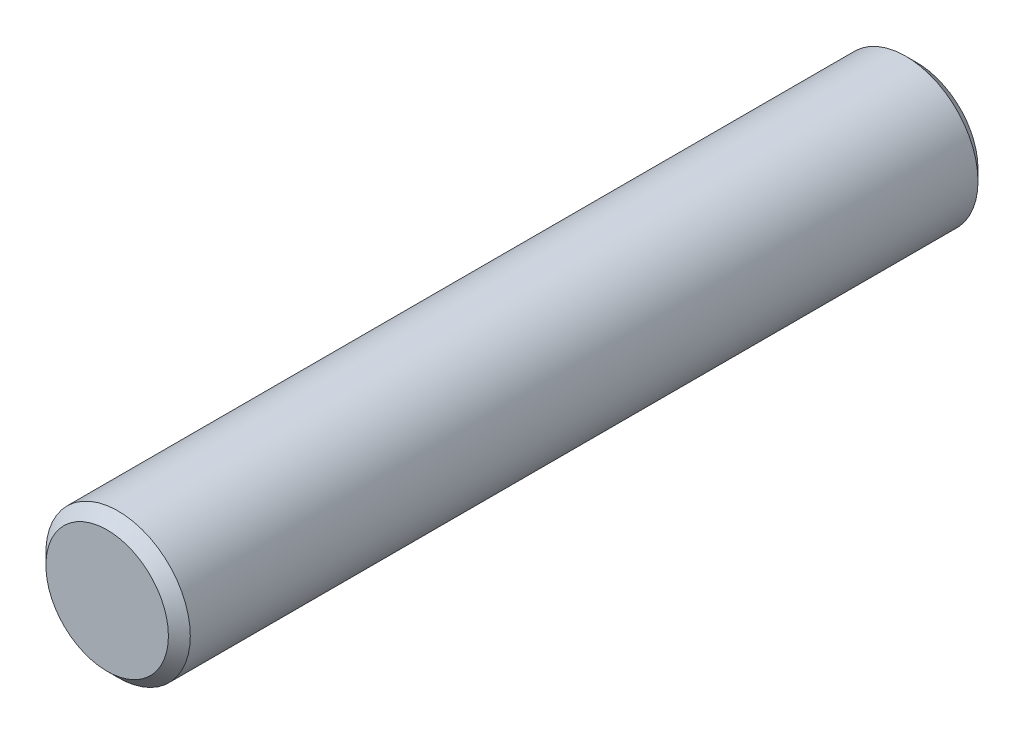
ISO-10303-21;
HEADER;
FILE_DESCRIPTION(('STEP AP214'),'2;1');
FILE_NAME('part.step','',(''),(''),'','','');
FILE_SCHEMA(('AUTOMOTIVE_DESIGN { 1 0 10303 214 1 1 1 1 }'));
ENDSEC;
DATA;
#1=APPLICATION_CONTEXT('core data for automotive mechanical design processes');
#2=APPLICATION_PROTOCOL_DEFINITION('international standard','automotive_design',2000,#1);
#3=PRODUCT_CONTEXT('',#1,'mechanical');
#4=PRODUCT('Part','Part','',(#3));
#5=PRODUCT_RELATED_PRODUCT_CATEGORY('part','',(#4));
#6=PRODUCT_DEFINITION_FORMATION('','',#4);
#7=PRODUCT_DEFINITION_CONTEXT('part definition',#1,'design');
#8=PRODUCT_DEFINITION('design','',#6,#7);
#9=PRODUCT_DEFINITION_SHAPE('','',#8);
#10=(LENGTH_UNIT() NAMED_UNIT(*) SI_UNIT(.MILLI.,.METRE.));
#11=(NAMED_UNIT(*) PLANE_ANGLE_UNIT() SI_UNIT($,.RADIAN.));
#12=(NAMED_UNIT(*) SI_UNIT($,.STERADIAN.) SOLID_ANGLE_UNIT());
#13=UNCERTAINTY_MEASURE_WITH_UNIT(LENGTH_MEASURE(1.E-05),#10,'distance_accuracy_value','');
#14=(GEOMETRIC_REPRESENTATION_CONTEXT(3) GLOBAL_UNCERTAINTY_ASSIGNED_CONTEXT((#13)) GLOBAL_UNIT_ASSIGNED_CONTEXT((#10,
#11,#12)) REPRESENTATION_CONTEXT('',''));
#15=CARTESIAN_POINT('',(0.,0.,0.));
#16=DIRECTION('',(0.,0.,1.));
#17=DIRECTION('',(1.,0.,0.));
#18=AXIS2_PLACEMENT_3D('',#15,#16,#17);
#19=CARTESIAN_POINT('',(0.,0.,37.));
#20=DIRECTION('',(0.,0.,-1.));
#21=DIRECTION('',(-1.,0.,0.));
#22=AXIS2_PLACEMENT_3D('',#19,#20,#21);
#23=CYLINDRICAL_SURFACE('',#22,3.3);
#24=CARTESIAN_POINT('',(0.,0.,0.5));
#25=DIRECTION('',(0.,0.,1.));
#26=DIRECTION('',(1.,0.,0.));
#27=AXIS2_PLACEMENT_3D('',#24,#25,#26);
#28=CIRCLE('',#27,3.3);
#29=CARTESIAN_POINT('',(3.3,0.,0.5));
#30=VERTEX_POINT('',#29);
#31=EDGE_CURVE('E59',#30,#30,#28,.T.);
#32=ORIENTED_EDGE('',*,*,#31,.T.);
#33=EDGE_LOOP('',(#32));
#34=FACE_BOUND('',#33,.T.);
#35=CARTESIAN_POINT('',(0.,0.,36.5));
#36=DIRECTION('',(0.,0.,1.));
#37=DIRECTION('',(1.,0.,0.));
#38=AXIS2_PLACEMENT_3D('',#35,#36,#37);
#39=CIRCLE('',#38,3.3);
#40=CARTESIAN_POINT('',(3.3,0.,36.5));
#41=VERTEX_POINT('',#40);
#42=EDGE_CURVE('E64',#41,#41,#39,.F.);
#43=ORIENTED_EDGE('',*,*,#42,.T.);
#44=EDGE_LOOP('',(#43));
#45=FACE_BOUND('',#44,.T.);
#46=ADVANCED_FACE('F45',(#34,#45),#23,.T.);
#47=CARTESIAN_POINT('',(0.,0.,37.));
#48=DIRECTION('',(0.,0.,1.));
#49=DIRECTION('',(1.,0.,0.));
#50=AXIS2_PLACEMENT_3D('',#47,#48,#49);
#51=PLANE('',#50);
#52=CARTESIAN_POINT('',(0.,0.,37.));
#53=DIRECTION('',(0.,0.,1.));
#54=DIRECTION('',(1.,0.,0.));
#55=AXIS2_PLACEMENT_3D('',#52,#53,#54);
#56=CIRCLE('',#55,2.80000000000001);
#57=CARTESIAN_POINT('',(2.80000000000001,0.,37.));
#58=VERTEX_POINT('',#57);
#59=EDGE_CURVE('E10',#58,#58,#56,.T.);
#60=ORIENTED_EDGE('',*,*,#59,.T.);
#61=EDGE_LOOP('',(#60));
#62=FACE_BOUND('',#61,.T.);
#63=ADVANCED_FACE('F81',(#62),#51,.T.);
#64=CARTESIAN_POINT('',(0.,0.,0.));
#65=DIRECTION('',(0.,0.,1.));
#66=DIRECTION('',(1.,0.,0.));
#67=AXIS2_PLACEMENT_3D('',#64,#65,#66);
#68=PLANE('',#67);
#69=CARTESIAN_POINT('',(0.,0.,0.));
#70=DIRECTION('',(0.,0.,1.));
#71=DIRECTION('',(1.,0.,0.));
#72=AXIS2_PLACEMENT_3D('',#69,#70,#71);
#73=CIRCLE('',#72,2.79999999999999);
#74=CARTESIAN_POINT('',(2.79999999999999,0.,0.));
#75=VERTEX_POINT('',#74);
#76=EDGE_CURVE('E54',#75,#75,#73,.F.);
#77=ORIENTED_EDGE('',*,*,#76,.T.);
#78=EDGE_LOOP('',(#77));
#79=FACE_BOUND('',#78,.T.);
#80=ADVANCED_FACE('F78',(#79),#68,.F.);
#81=CARTESIAN_POINT('',(0.,0.,0.5));
#82=DIRECTION('',(0.,0.,1.));
#83=DIRECTION('',(1.,0.,0.));
#84=AXIS2_PLACEMENT_3D('',#81,#82,#83);
#85=CONICAL_SURFACE('',#84,3.3,0.785398163397455);
#86=ORIENTED_EDGE('',*,*,#76,.F.);
#87=EDGE_LOOP('',(#86));
#88=FACE_BOUND('',#87,.T.);
#89=ORIENTED_EDGE('',*,*,#31,.F.);
#90=EDGE_LOOP('',(#89));
#91=FACE_BOUND('',#90,.T.);
#92=ADVANCED_FACE('F74',(#88,#91),#85,.T.);
#93=CARTESIAN_POINT('',(0.,0.,37.));
#94=DIRECTION('',(0.,0.,-1.));
#95=DIRECTION('',(-1.,0.,0.));
#96=AXIS2_PLACEMENT_3D('',#93,#94,#95);
#97=CONICAL_SURFACE('',#96,2.80000000000001,0.785398163397451);
#98=ORIENTED_EDGE('',*,*,#42,.F.);
#99=EDGE_LOOP('',(#98));
#100=FACE_BOUND('',#99,.T.);
#101=ORIENTED_EDGE('',*,*,#59,.F.);
#102=EDGE_LOOP('',(#101));
#103=FACE_BOUND('',#102,.T.);
#104=ADVANCED_FACE('F48',(#100,#103),#97,.T.);
#105=CLOSED_SHELL('',(#46,#63,#80,#92,#104));
#106=MANIFOLD_SOLID_BREP('B2',#105);
#107=ADVANCED_BREP_SHAPE_REPRESENTATION('',(#18,#106),#14);
#108=SHAPE_DEFINITION_REPRESENTATION(#9,#107);
ENDSEC;
END-ISO-10303-21;
